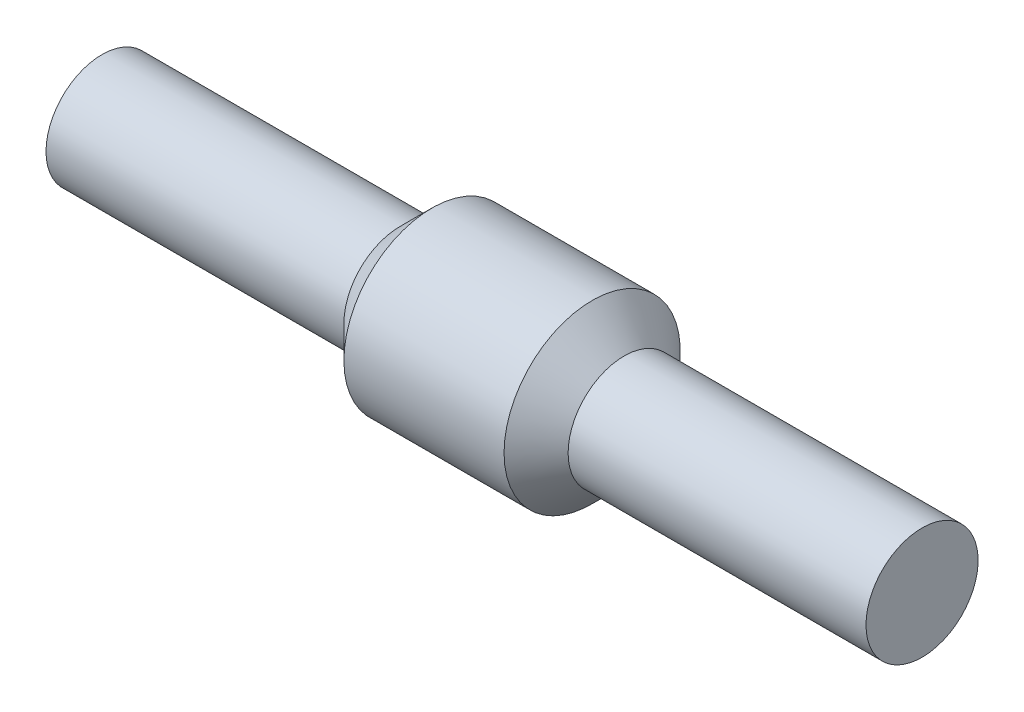
ISO-10303-21;
HEADER;
FILE_DESCRIPTION(('STEP AP214'),'2;1');
FILE_NAME('part.step','',(''),(''),'','','');
FILE_SCHEMA(('AUTOMOTIVE_DESIGN { 1 0 10303 214 1 1 1 1 }'));
ENDSEC;
DATA;
#1=APPLICATION_CONTEXT('core data for automotive mechanical design processes');
#2=APPLICATION_PROTOCOL_DEFINITION('international standard','automotive_design',2000,#1);
#3=PRODUCT_CONTEXT('',#1,'mechanical');
#4=PRODUCT('Part','Part','',(#3));
#5=PRODUCT_RELATED_PRODUCT_CATEGORY('part','',(#4));
#6=PRODUCT_DEFINITION_FORMATION('','',#4);
#7=PRODUCT_DEFINITION_CONTEXT('part definition',#1,'design');
#8=PRODUCT_DEFINITION('design','',#6,#7);
#9=PRODUCT_DEFINITION_SHAPE('','',#8);
#10=(LENGTH_UNIT() NAMED_UNIT(*) SI_UNIT(.MILLI.,.METRE.));
#11=(NAMED_UNIT(*) PLANE_ANGLE_UNIT() SI_UNIT($,.RADIAN.));
#12=(NAMED_UNIT(*) SI_UNIT($,.STERADIAN.) SOLID_ANGLE_UNIT());
#13=UNCERTAINTY_MEASURE_WITH_UNIT(LENGTH_MEASURE(1.E-05),#10,'distance_accuracy_value','');
#14=(GEOMETRIC_REPRESENTATION_CONTEXT(3) GLOBAL_UNCERTAINTY_ASSIGNED_CONTEXT((#13)) GLOBAL_UNIT_ASSIGNED_CONTEXT((#10,
#11,#12)) REPRESENTATION_CONTEXT('',''));
#15=CARTESIAN_POINT('',(0.,0.,0.));
#16=DIRECTION('',(0.,0.,1.));
#17=DIRECTION('',(1.,0.,0.));
#18=AXIS2_PLACEMENT_3D('',#15,#16,#17);
#19=CARTESIAN_POINT('',(12.8,0.,0.));
#20=DIRECTION('',(-1.,0.,0.));
#21=DIRECTION('',(0.,0.,1.));
#22=AXIS2_PLACEMENT_3D('',#19,#20,#21);
#23=PLANE('',#22);
#24=CARTESIAN_POINT('',(12.8,0.,0.));
#25=DIRECTION('',(-1.,0.,0.));
#26=DIRECTION('',(0.,0.,1.));
#27=AXIS2_PLACEMENT_3D('',#24,#25,#26);
#28=CIRCLE('',#27,1.74999999999999);
#29=CARTESIAN_POINT('',(12.8,0.,1.74999999999999));
#30=VERTEX_POINT('',#29);
#31=EDGE_CURVE('E10',#30,#30,#28,.T.);
#32=ORIENTED_EDGE('',*,*,#31,.F.);
#33=EDGE_LOOP('',(#32));
#34=FACE_BOUND('',#33,.T.);
#35=ADVANCED_FACE('F31',(#34),#23,.F.);
#36=CARTESIAN_POINT('',(-20.,0.,0.));
#37=DIRECTION('',(-1.,0.,0.));
#38=DIRECTION('',(0.,0.,1.));
#39=AXIS2_PLACEMENT_3D('',#36,#37,#38);
#40=CYLINDRICAL_SURFACE('',#39,1.74999999999999);
#41=CARTESIAN_POINT('',(3.5,0.,0.));
#42=DIRECTION('',(-1.,0.,0.));
#43=DIRECTION('',(0.,0.,1.));
#44=AXIS2_PLACEMENT_3D('',#41,#42,#43);
#45=CIRCLE('',#44,1.74999999999999);
#46=CARTESIAN_POINT('',(3.5,0.,1.74999999999999));
#47=VERTEX_POINT('',#46);
#48=EDGE_CURVE('E37',#47,#47,#45,.T.);
#49=ORIENTED_EDGE('',*,*,#48,.F.);
#50=EDGE_LOOP('',(#49));
#51=FACE_BOUND('',#50,.T.);
#52=ORIENTED_EDGE('',*,*,#31,.T.);
#53=EDGE_LOOP('',(#52));
#54=FACE_BOUND('',#53,.T.);
#55=ADVANCED_FACE('F73',(#51,#54),#40,.T.);
#56=CARTESIAN_POINT('',(3.5,0.,0.));
#57=DIRECTION('',(-1.,0.,0.));
#58=DIRECTION('',(0.,0.,1.));
#59=AXIS2_PLACEMENT_3D('',#56,#57,#58);
#60=CONICAL_SURFACE('',#59,1.74999999999999,0.785398163397451);
#61=CARTESIAN_POINT('',(2.5,0.,0.));
#62=DIRECTION('',(-1.,0.,0.));
#63=DIRECTION('',(0.,0.,1.));
#64=AXIS2_PLACEMENT_3D('',#61,#62,#63);
#65=CIRCLE('',#64,2.74999999999999);
#66=CARTESIAN_POINT('',(2.5,0.,2.74999999999999));
#67=VERTEX_POINT('',#66);
#68=EDGE_CURVE('E41',#67,#67,#65,.T.);
#69=ORIENTED_EDGE('',*,*,#68,.F.);
#70=EDGE_LOOP('',(#69));
#71=FACE_BOUND('',#70,.T.);
#72=ORIENTED_EDGE('',*,*,#48,.T.);
#73=EDGE_LOOP('',(#72));
#74=FACE_BOUND('',#73,.T.);
#75=ADVANCED_FACE('F63',(#71,#74),#60,.T.);
#76=CARTESIAN_POINT('',(-20.,0.,0.));
#77=DIRECTION('',(-1.,0.,0.));
#78=DIRECTION('',(0.,0.,1.));
#79=AXIS2_PLACEMENT_3D('',#76,#77,#78);
#80=CYLINDRICAL_SURFACE('',#79,2.75);
#81=ORIENTED_EDGE('',*,*,#68,.T.);
#82=EDGE_LOOP('',(#81));
#83=FACE_BOUND('',#82,.T.);
#84=CARTESIAN_POINT('',(-2.5,0.,0.));
#85=DIRECTION('',(-1.,0.,0.));
#86=DIRECTION('',(0.,0.,1.));
#87=AXIS2_PLACEMENT_3D('',#84,#85,#86);
#88=CIRCLE('',#87,2.74999999999999);
#89=CARTESIAN_POINT('',(-2.5,0.,2.74999999999999));
#90=VERTEX_POINT('',#89);
#91=EDGE_CURVE('E53',#90,#90,#88,.T.);
#92=ORIENTED_EDGE('',*,*,#91,.F.);
#93=EDGE_LOOP('',(#92));
#94=FACE_BOUND('',#93,.T.);
#95=ADVANCED_FACE('F60',(#83,#94),#80,.T.);
#96=CARTESIAN_POINT('',(-12.8,0.,0.));
#97=DIRECTION('',(1.,0.,0.));
#98=DIRECTION('',(0.,0.,1.));
#99=AXIS2_PLACEMENT_3D('',#96,#97,#98);
#100=PLANE('',#99);
#101=CARTESIAN_POINT('',(-12.8,0.,0.));
#102=DIRECTION('',(-1.,0.,0.));
#103=DIRECTION('',(0.,0.,1.));
#104=AXIS2_PLACEMENT_3D('',#101,#102,#103);
#105=CIRCLE('',#104,1.74999999999999);
#106=CARTESIAN_POINT('',(-12.8,0.,1.74999999999999));
#107=VERTEX_POINT('',#106);
#108=EDGE_CURVE('E45',#107,#107,#105,.T.);
#109=ORIENTED_EDGE('',*,*,#108,.T.);
#110=EDGE_LOOP('',(#109));
#111=FACE_BOUND('',#110,.T.);
#112=ADVANCED_FACE('F62',(#111),#100,.F.);
#113=CARTESIAN_POINT('',(20.,0.,0.));
#114=DIRECTION('',(1.,0.,0.));
#115=DIRECTION('',(0.,0.,1.));
#116=AXIS2_PLACEMENT_3D('',#113,#114,#115);
#117=CYLINDRICAL_SURFACE('',#116,1.74999999999999);
#118=CARTESIAN_POINT('',(-3.5,0.,0.));
#119=DIRECTION('',(-1.,0.,0.));
#120=DIRECTION('',(0.,0.,1.));
#121=AXIS2_PLACEMENT_3D('',#118,#119,#120);
#122=CIRCLE('',#121,1.74999999999999);
#123=CARTESIAN_POINT('',(-3.5,0.,1.74999999999999));
#124=VERTEX_POINT('',#123);
#125=EDGE_CURVE('E50',#124,#124,#122,.T.);
#126=ORIENTED_EDGE('',*,*,#125,.T.);
#127=EDGE_LOOP('',(#126));
#128=FACE_BOUND('',#127,.T.);
#129=ORIENTED_EDGE('',*,*,#108,.F.);
#130=EDGE_LOOP('',(#129));
#131=FACE_BOUND('',#130,.T.);
#132=ADVANCED_FACE('F70',(#128,#131),#117,.T.);
#133=CARTESIAN_POINT('',(-3.5,0.,0.));
#134=DIRECTION('',(1.,0.,0.));
#135=DIRECTION('',(0.,0.,1.));
#136=AXIS2_PLACEMENT_3D('',#133,#134,#135);
#137=CONICAL_SURFACE('',#136,1.74999999999999,0.785398163397451);
#138=ORIENTED_EDGE('',*,*,#91,.T.);
#139=EDGE_LOOP('',(#138));
#140=FACE_BOUND('',#139,.T.);
#141=ORIENTED_EDGE('',*,*,#125,.F.);
#142=EDGE_LOOP('',(#141));
#143=FACE_BOUND('',#142,.T.);
#144=ADVANCED_FACE('F57',(#140,#143),#137,.T.);
#145=CLOSED_SHELL('',(#35,#55,#75,#95,#112,#132,#144));
#146=MANIFOLD_SOLID_BREP('B2',#145);
#147=ADVANCED_BREP_SHAPE_REPRESENTATION('',(#18,#146),#14);
#148=SHAPE_DEFINITION_REPRESENTATION(#9,#147);
ENDSEC;
END-ISO-10303-21;
